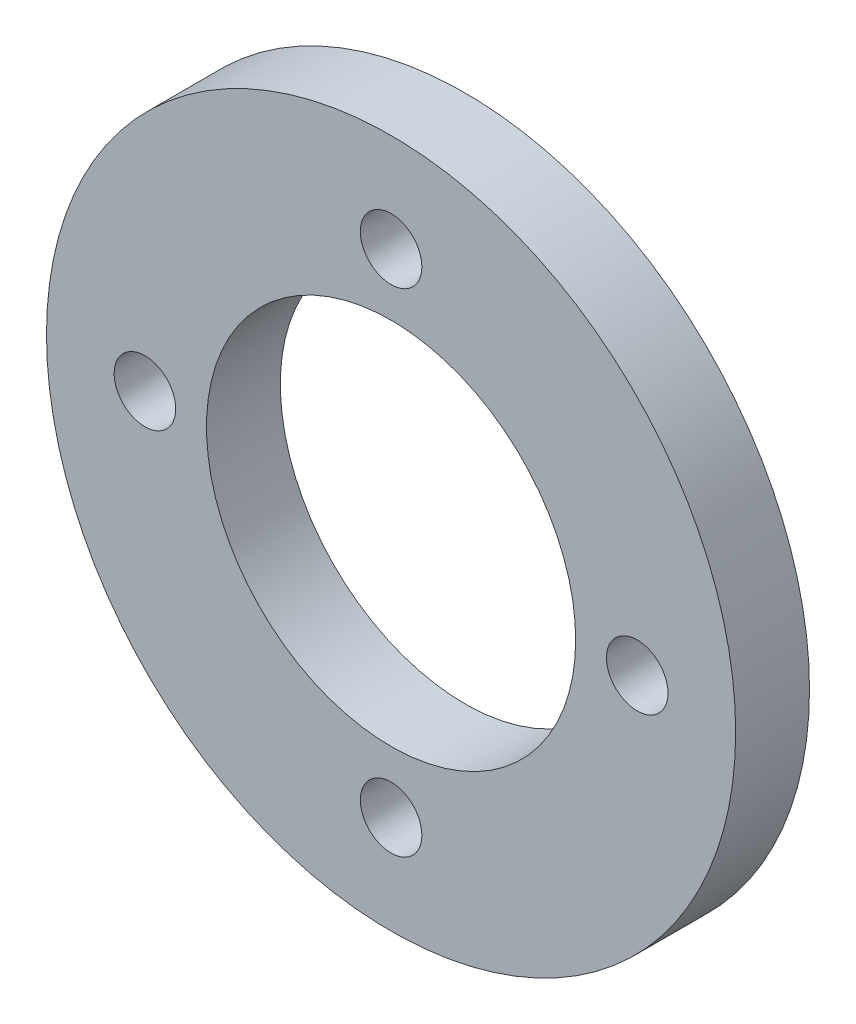
ISO-10303-21;
HEADER;
FILE_DESCRIPTION(('STEP AP214'),'2;1');
FILE_NAME('part.step','',(''),(''),'','','');
FILE_SCHEMA(('AUTOMOTIVE_DESIGN { 1 0 10303 214 1 1 1 1 }'));
ENDSEC;
DATA;
#1=APPLICATION_CONTEXT('core data for automotive mechanical design processes');
#2=APPLICATION_PROTOCOL_DEFINITION('international standard','automotive_design',2000,#1);
#3=PRODUCT_CONTEXT('',#1,'mechanical');
#4=PRODUCT('Part','Part','',(#3));
#5=PRODUCT_RELATED_PRODUCT_CATEGORY('part','',(#4));
#6=PRODUCT_DEFINITION_FORMATION('','',#4);
#7=PRODUCT_DEFINITION_CONTEXT('part definition',#1,'design');
#8=PRODUCT_DEFINITION('design','',#6,#7);
#9=PRODUCT_DEFINITION_SHAPE('','',#8);
#10=(LENGTH_UNIT() NAMED_UNIT(*) SI_UNIT(.MILLI.,.METRE.));
#11=(NAMED_UNIT(*) PLANE_ANGLE_UNIT() SI_UNIT($,.RADIAN.));
#12=(NAMED_UNIT(*) SI_UNIT($,.STERADIAN.) SOLID_ANGLE_UNIT());
#13=UNCERTAINTY_MEASURE_WITH_UNIT(LENGTH_MEASURE(1.E-05),#10,'distance_accuracy_value','');
#14=(GEOMETRIC_REPRESENTATION_CONTEXT(3) GLOBAL_UNCERTAINTY_ASSIGNED_CONTEXT((#13)) GLOBAL_UNIT_ASSIGNED_CONTEXT((#10,
#11,#12)) REPRESENTATION_CONTEXT('',''));
#15=CARTESIAN_POINT('',(0.,0.,0.));
#16=DIRECTION('',(0.,0.,1.));
#17=DIRECTION('',(1.,0.,0.));
#18=AXIS2_PLACEMENT_3D('',#15,#16,#17);
#19=CARTESIAN_POINT('',(0.,0.,3.));
#20=DIRECTION('',(0.,0.,-1.));
#21=DIRECTION('',(-1.,0.,0.));
#22=AXIS2_PLACEMENT_3D('',#19,#20,#21);
#23=CYLINDRICAL_SURFACE('',#22,14.);
#24=CARTESIAN_POINT('',(0.,0.,3.));
#25=DIRECTION('',(0.,0.,1.));
#26=DIRECTION('',(1.,0.,0.));
#27=AXIS2_PLACEMENT_3D('',#24,#25,#26);
#28=CIRCLE('',#27,14.);
#29=CARTESIAN_POINT('',(14.,0.,3.));
#30=VERTEX_POINT('',#29);
#31=EDGE_CURVE('E10',#30,#30,#28,.T.);
#32=ORIENTED_EDGE('',*,*,#31,.F.);
#33=EDGE_LOOP('',(#32));
#34=FACE_BOUND('',#33,.T.);
#35=CARTESIAN_POINT('',(0.,0.,0.));
#36=DIRECTION('',(0.,0.,1.));
#37=DIRECTION('',(1.,0.,0.));
#38=AXIS2_PLACEMENT_3D('',#35,#36,#37);
#39=CIRCLE('',#38,14.);
#40=CARTESIAN_POINT('',(14.,0.,0.));
#41=VERTEX_POINT('',#40);
#42=EDGE_CURVE('E39',#41,#41,#39,.T.);
#43=ORIENTED_EDGE('',*,*,#42,.T.);
#44=EDGE_LOOP('',(#43));
#45=FACE_BOUND('',#44,.T.);
#46=ADVANCED_FACE('F32',(#34,#45),#23,.T.);
#47=CARTESIAN_POINT('',(0.,0.,3.));
#48=DIRECTION('',(0.,0.,1.));
#49=DIRECTION('',(1.,0.,0.));
#50=AXIS2_PLACEMENT_3D('',#47,#48,#49);
#51=PLANE('',#50);
#52=CARTESIAN_POINT('',(0.,0.,3.));
#53=DIRECTION('',(0.,0.,1.));
#54=DIRECTION('',(1.,0.,0.));
#55=AXIS2_PLACEMENT_3D('',#52,#53,#54);
#56=CIRCLE('',#55,7.5);
#57=CARTESIAN_POINT('',(7.5,0.,3.));
#58=VERTEX_POINT('',#57);
#59=EDGE_CURVE('E69',#58,#58,#56,.T.);
#60=ORIENTED_EDGE('',*,*,#59,.F.);
#61=EDGE_LOOP('',(#60));
#62=FACE_BOUND('',#61,.T.);
#63=CARTESIAN_POINT('',(9.99999999999999,0.,3.));
#64=DIRECTION('',(0.,0.,1.));
#65=DIRECTION('',(1.,0.,0.));
#66=AXIS2_PLACEMENT_3D('',#63,#64,#65);
#67=CIRCLE('',#66,1.25);
#68=CARTESIAN_POINT('',(11.25,0.,3.));
#69=VERTEX_POINT('',#68);
#70=EDGE_CURVE('E64',#69,#69,#67,.T.);
#71=ORIENTED_EDGE('',*,*,#70,.F.);
#72=EDGE_LOOP('',(#71));
#73=FACE_BOUND('',#72,.T.);
#74=CARTESIAN_POINT('',(0.,10.,3.));
#75=DIRECTION('',(0.,0.,1.));
#76=DIRECTION('',(1.,0.,0.));
#77=AXIS2_PLACEMENT_3D('',#74,#75,#76);
#78=CIRCLE('',#77,1.25);
#79=CARTESIAN_POINT('',(1.24999999999999,10.,3.));
#80=VERTEX_POINT('',#79);
#81=EDGE_CURVE('E58',#80,#80,#78,.T.);
#82=ORIENTED_EDGE('',*,*,#81,.F.);
#83=EDGE_LOOP('',(#82));
#84=FACE_BOUND('',#83,.T.);
#85=CARTESIAN_POINT('',(-10.,0.,3.));
#86=DIRECTION('',(0.,0.,1.));
#87=DIRECTION('',(1.,0.,0.));
#88=AXIS2_PLACEMENT_3D('',#85,#86,#87);
#89=CIRCLE('',#88,1.25);
#90=CARTESIAN_POINT('',(-8.75000000000001,0.,3.));
#91=VERTEX_POINT('',#90);
#92=EDGE_CURVE('E52',#91,#91,#89,.T.);
#93=ORIENTED_EDGE('',*,*,#92,.F.);
#94=EDGE_LOOP('',(#93));
#95=FACE_BOUND('',#94,.T.);
#96=CARTESIAN_POINT('',(0.,-10.,3.));
#97=DIRECTION('',(0.,0.,1.));
#98=DIRECTION('',(1.,0.,0.));
#99=AXIS2_PLACEMENT_3D('',#96,#97,#98);
#100=CIRCLE('',#99,1.25);
#101=CARTESIAN_POINT('',(1.25,-10.,3.));
#102=VERTEX_POINT('',#101);
#103=EDGE_CURVE('E46',#102,#102,#100,.T.);
#104=ORIENTED_EDGE('',*,*,#103,.F.);
#105=EDGE_LOOP('',(#104));
#106=FACE_BOUND('',#105,.T.);
#107=ORIENTED_EDGE('',*,*,#31,.T.);
#108=EDGE_LOOP('',(#107));
#109=FACE_BOUND('',#108,.T.);
#110=ADVANCED_FACE('F90',(#62,#73,#84,#95,#106,#109),#51,.T.);
#111=CARTESIAN_POINT('',(0.,0.,0.));
#112=DIRECTION('',(0.,0.,1.));
#113=DIRECTION('',(1.,0.,0.));
#114=AXIS2_PLACEMENT_3D('',#111,#112,#113);
#115=PLANE('',#114);
#116=CARTESIAN_POINT('',(0.,0.,0.));
#117=DIRECTION('',(0.,0.,1.));
#118=DIRECTION('',(1.,0.,0.));
#119=AXIS2_PLACEMENT_3D('',#116,#117,#118);
#120=CIRCLE('',#119,7.5);
#121=CARTESIAN_POINT('',(7.5,0.,0.));
#122=VERTEX_POINT('',#121);
#123=EDGE_CURVE('E35',#122,#122,#120,.T.);
#124=ORIENTED_EDGE('',*,*,#123,.T.);
#125=EDGE_LOOP('',(#124));
#126=FACE_BOUND('',#125,.T.);
#127=CARTESIAN_POINT('',(9.99999999999999,0.,0.));
#128=DIRECTION('',(0.,0.,1.));
#129=DIRECTION('',(1.,0.,0.));
#130=AXIS2_PLACEMENT_3D('',#127,#128,#129);
#131=CIRCLE('',#130,1.25);
#132=CARTESIAN_POINT('',(11.25,0.,0.));
#133=VERTEX_POINT('',#132);
#134=EDGE_CURVE('E44',#133,#133,#131,.T.);
#135=ORIENTED_EDGE('',*,*,#134,.T.);
#136=EDGE_LOOP('',(#135));
#137=FACE_BOUND('',#136,.T.);
#138=CARTESIAN_POINT('',(0.,10.,0.));
#139=DIRECTION('',(0.,0.,1.));
#140=DIRECTION('',(1.,0.,0.));
#141=AXIS2_PLACEMENT_3D('',#138,#139,#140);
#142=CIRCLE('',#141,1.25);
#143=CARTESIAN_POINT('',(1.24999999999999,10.,0.));
#144=VERTEX_POINT('',#143);
#145=EDGE_CURVE('E61',#144,#144,#142,.T.);
#146=ORIENTED_EDGE('',*,*,#145,.T.);
#147=EDGE_LOOP('',(#146));
#148=FACE_BOUND('',#147,.T.);
#149=CARTESIAN_POINT('',(-10.,0.,0.));
#150=DIRECTION('',(0.,0.,1.));
#151=DIRECTION('',(1.,0.,0.));
#152=AXIS2_PLACEMENT_3D('',#149,#150,#151);
#153=CIRCLE('',#152,1.25);
#154=CARTESIAN_POINT('',(-8.75000000000001,0.,0.));
#155=VERTEX_POINT('',#154);
#156=EDGE_CURVE('E55',#155,#155,#153,.T.);
#157=ORIENTED_EDGE('',*,*,#156,.T.);
#158=EDGE_LOOP('',(#157));
#159=FACE_BOUND('',#158,.T.);
#160=CARTESIAN_POINT('',(0.,-10.,0.));
#161=DIRECTION('',(0.,0.,1.));
#162=DIRECTION('',(1.,0.,0.));
#163=AXIS2_PLACEMENT_3D('',#160,#161,#162);
#164=CIRCLE('',#163,1.25);
#165=CARTESIAN_POINT('',(1.25,-10.,0.));
#166=VERTEX_POINT('',#165);
#167=EDGE_CURVE('E49',#166,#166,#164,.T.);
#168=ORIENTED_EDGE('',*,*,#167,.T.);
#169=EDGE_LOOP('',(#168));
#170=FACE_BOUND('',#169,.T.);
#171=ORIENTED_EDGE('',*,*,#42,.F.);
#172=EDGE_LOOP('',(#171));
#173=FACE_BOUND('',#172,.T.);
#174=ADVANCED_FACE('F76',(#126,#137,#148,#159,#170,#173),#115,.F.);
#175=CARTESIAN_POINT('',(0.,-10.,0.));
#176=DIRECTION('',(0.,0.,1.));
#177=DIRECTION('',(1.,0.,0.));
#178=AXIS2_PLACEMENT_3D('',#175,#176,#177);
#179=CYLINDRICAL_SURFACE('',#178,1.25);
#180=ORIENTED_EDGE('',*,*,#167,.F.);
#181=EDGE_LOOP('',(#180));
#182=FACE_BOUND('',#181,.T.);
#183=ORIENTED_EDGE('',*,*,#103,.T.);
#184=EDGE_LOOP('',(#183));
#185=FACE_BOUND('',#184,.T.);
#186=ADVANCED_FACE('F102',(#182,#185),#179,.F.);
#187=CARTESIAN_POINT('',(-10.,0.,0.));
#188=DIRECTION('',(0.,0.,1.));
#189=DIRECTION('',(1.,0.,0.));
#190=AXIS2_PLACEMENT_3D('',#187,#188,#189);
#191=CYLINDRICAL_SURFACE('',#190,1.25);
#192=ORIENTED_EDGE('',*,*,#156,.F.);
#193=EDGE_LOOP('',(#192));
#194=FACE_BOUND('',#193,.T.);
#195=ORIENTED_EDGE('',*,*,#92,.T.);
#196=EDGE_LOOP('',(#195));
#197=FACE_BOUND('',#196,.T.);
#198=ADVANCED_FACE('F106',(#194,#197),#191,.F.);
#199=CARTESIAN_POINT('',(0.,10.,0.));
#200=DIRECTION('',(0.,0.,1.));
#201=DIRECTION('',(1.,0.,0.));
#202=AXIS2_PLACEMENT_3D('',#199,#200,#201);
#203=CYLINDRICAL_SURFACE('',#202,1.25);
#204=ORIENTED_EDGE('',*,*,#145,.F.);
#205=EDGE_LOOP('',(#204));
#206=FACE_BOUND('',#205,.T.);
#207=ORIENTED_EDGE('',*,*,#81,.T.);
#208=EDGE_LOOP('',(#207));
#209=FACE_BOUND('',#208,.T.);
#210=ADVANCED_FACE('F86',(#206,#209),#203,.F.);
#211=CARTESIAN_POINT('',(9.99999999999999,0.,0.));
#212=DIRECTION('',(0.,0.,1.));
#213=DIRECTION('',(1.,0.,0.));
#214=AXIS2_PLACEMENT_3D('',#211,#212,#213);
#215=CYLINDRICAL_SURFACE('',#214,1.25);
#216=ORIENTED_EDGE('',*,*,#134,.F.);
#217=EDGE_LOOP('',(#216));
#218=FACE_BOUND('',#217,.T.);
#219=ORIENTED_EDGE('',*,*,#70,.T.);
#220=EDGE_LOOP('',(#219));
#221=FACE_BOUND('',#220,.T.);
#222=ADVANCED_FACE('F81',(#218,#221),#215,.F.);
#223=CARTESIAN_POINT('',(0.,0.,-7.));
#224=DIRECTION('',(0.,0.,1.));
#225=DIRECTION('',(1.,0.,0.));
#226=AXIS2_PLACEMENT_3D('',#223,#224,#225);
#227=CYLINDRICAL_SURFACE('',#226,7.5);
#228=ORIENTED_EDGE('',*,*,#59,.T.);
#229=EDGE_LOOP('',(#228));
#230=FACE_BOUND('',#229,.T.);
#231=ORIENTED_EDGE('',*,*,#123,.F.);
#232=EDGE_LOOP('',(#231));
#233=FACE_BOUND('',#232,.T.);
#234=ADVANCED_FACE('F79',(#230,#233),#227,.F.);
#235=CLOSED_SHELL('',(#46,#110,#174,#186,#198,#210,#222,#234));
#236=MANIFOLD_SOLID_BREP('B2',#235);
#237=ADVANCED_BREP_SHAPE_REPRESENTATION('',(#18,#236),#14);
#238=SHAPE_DEFINITION_REPRESENTATION(#9,#237);
ENDSEC;
END-ISO-10303-21;
